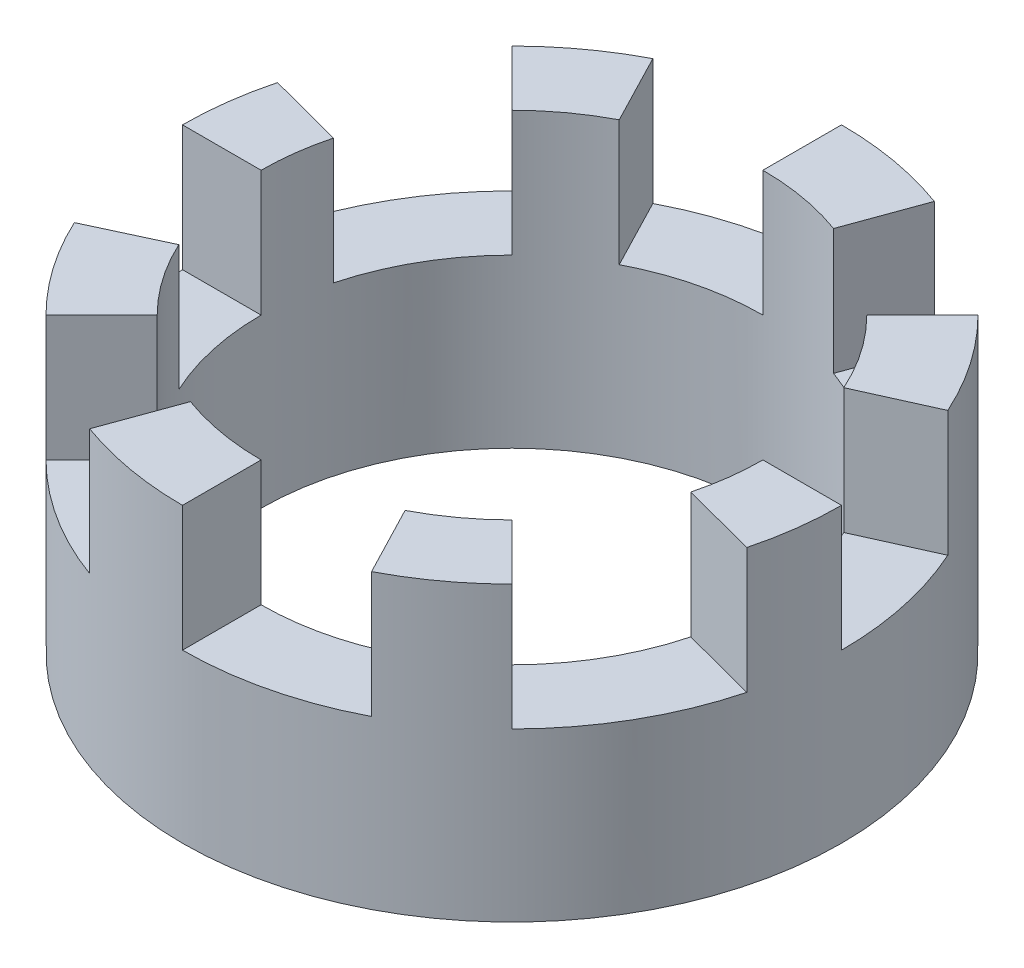
ISO-10303-21;
HEADER;
FILE_DESCRIPTION(('STEP AP214'),'2;1');
FILE_NAME('part.step','',(''),(''),'','','');
FILE_SCHEMA(('AUTOMOTIVE_DESIGN { 1 0 10303 214 1 1 1 1 }'));
ENDSEC;
DATA;
#1=APPLICATION_CONTEXT('core data for automotive mechanical design processes');
#2=APPLICATION_PROTOCOL_DEFINITION('international standard','automotive_design',2000,#1);
#3=PRODUCT_CONTEXT('',#1,'mechanical');
#4=PRODUCT('Part','Part','',(#3));
#5=PRODUCT_RELATED_PRODUCT_CATEGORY('part','',(#4));
#6=PRODUCT_DEFINITION_FORMATION('','',#4);
#7=PRODUCT_DEFINITION_CONTEXT('part definition',#1,'design');
#8=PRODUCT_DEFINITION('design','',#6,#7);
#9=PRODUCT_DEFINITION_SHAPE('','',#8);
#10=(LENGTH_UNIT() NAMED_UNIT(*) SI_UNIT(.MILLI.,.METRE.));
#11=(NAMED_UNIT(*) PLANE_ANGLE_UNIT() SI_UNIT($,.RADIAN.));
#12=(NAMED_UNIT(*) SI_UNIT($,.STERADIAN.) SOLID_ANGLE_UNIT());
#13=UNCERTAINTY_MEASURE_WITH_UNIT(LENGTH_MEASURE(1.E-05),#10,'distance_accuracy_value','');
#14=(GEOMETRIC_REPRESENTATION_CONTEXT(3) GLOBAL_UNCERTAINTY_ASSIGNED_CONTEXT((#13)) GLOBAL_UNIT_ASSIGNED_CONTEXT((#10,
#11,#12)) REPRESENTATION_CONTEXT('',''));
#15=CARTESIAN_POINT('',(0.,0.,0.));
#16=DIRECTION('',(0.,0.,1.));
#17=DIRECTION('',(1.,0.,0.));
#18=AXIS2_PLACEMENT_3D('',#15,#16,#17);
#19=CARTESIAN_POINT('',(0.,20.,0.));
#20=DIRECTION('',(0.,1.,0.));
#21=DIRECTION('',(0.,0.,1.));
#22=AXIS2_PLACEMENT_3D('',#19,#20,#21);
#23=PLANE('',#22);
#24=DIRECTION('',(0.460317164455009,0.,0.887754531448925));
#25=VECTOR('',#24,1.);
#26=CARTESIAN_POINT('',(3.60362018626562E-13,20.,-1.86854380028592E-13));
#27=LINE('',#26,#25);
#28=CARTESIAN_POINT('',(-18.136496279527,20.,-34.9775285390878));
#29=VERTEX_POINT('',#28);
#30=CARTESIAN_POINT('',(-13.8095149336499,20.,-26.6326359434679));
#31=VERTEX_POINT('',#30);
#32=EDGE_CURVE('E263',#29,#31,#27,.T.);
#33=ORIENTED_EDGE('',*,*,#32,.T.);
#34=CARTESIAN_POINT('',(0.,20.,0.));
#35=DIRECTION('',(0.,1.,0.));
#36=DIRECTION('',(0.,0.,1.));
#37=AXIS2_PLACEMENT_3D('',#34,#35,#36);
#38=CIRCLE('',#37,30.);
#39=CARTESIAN_POINT('',(0.,20.,-30.));
#40=VERTEX_POINT('',#39);
#41=EDGE_CURVE('E561',#40,#31,#38,.T.);
#42=ORIENTED_EDGE('',*,*,#41,.F.);
#43=DIRECTION('',(0.,0.,-1.));
#44=VECTOR('',#43,1.);
#45=CARTESIAN_POINT('',(0.,20.,0.));
#46=LINE('',#45,#44);
#47=CARTESIAN_POINT('',(0.,20.,-39.4));
#48=VERTEX_POINT('',#47);
#49=EDGE_CURVE('E71',#40,#48,#46,.T.);
#50=ORIENTED_EDGE('',*,*,#49,.T.);
#51=CARTESIAN_POINT('',(0.,20.,0.));
#52=DIRECTION('',(0.,1.,0.));
#53=DIRECTION('',(0.,0.,1.));
#54=AXIS2_PLACEMENT_3D('',#51,#52,#53);
#55=CIRCLE('',#54,39.4);
#56=EDGE_CURVE('E644',#48,#29,#55,.T.);
#57=ORIENTED_EDGE('',*,*,#56,.T.);
#58=EDGE_LOOP('',(#33,#42,#50,#57));
#59=FACE_BOUND('',#58,.T.);
#60=ADVANCED_FACE('F45',(#59),#23,.T.);
#61=DIRECTION('',(-0.707106781186556,0.,-0.707106781186539));
#62=VECTOR('',#61,1.);
#63=CARTESIAN_POINT('',(0.,20.,0.));
#64=LINE('',#63,#62);
#65=CARTESIAN_POINT('',(-21.2132034355967,20.,-21.2132034355962));
#66=VERTEX_POINT('',#65);
#67=CARTESIAN_POINT('',(-27.8600071787503,20.,-27.8600071787496));
#68=VERTEX_POINT('',#67);
#69=EDGE_CURVE('E63',#66,#68,#64,.T.);
#70=ORIENTED_EDGE('',*,*,#69,.T.);
#71=CARTESIAN_POINT('',(-38.0947187353614,20.,-10.0574551688639));
#72=VERTEX_POINT('',#71);
#73=EDGE_CURVE('E56',#68,#72,#55,.T.);
#74=ORIENTED_EDGE('',*,*,#73,.T.);
#75=DIRECTION('',(0.966871033892421,0.,0.255265359615834));
#76=VECTOR('',#75,1.);
#77=CARTESIAN_POINT('',(0.,20.,0.));
#78=LINE('',#77,#76);
#79=CARTESIAN_POINT('',(-29.0061310167726,20.,-7.65796078847503));
#80=VERTEX_POINT('',#79);
#81=EDGE_CURVE('E517',#72,#80,#78,.T.);
#82=ORIENTED_EDGE('',*,*,#81,.T.);
#83=EDGE_CURVE('E555',#66,#80,#38,.T.);
#84=ORIENTED_EDGE('',*,*,#83,.F.);
#85=EDGE_LOOP('',(#70,#74,#82,#84));
#86=FACE_BOUND('',#85,.T.);
#87=ADVANCED_FACE('F664',(#86),#23,.T.);
#88=DIRECTION('',(-0.911762985049743,0.,0.410716762615287));
#89=VECTOR('',#88,1.);
#90=CARTESIAN_POINT('',(0.,20.,0.));
#91=LINE('',#90,#89);
#92=CARTESIAN_POINT('',(35.9234616109599,20.,-16.1822404470424));
#93=VERTEX_POINT('',#92);
#94=CARTESIAN_POINT('',(27.3528895514923,20.,-12.3215028784587));
#95=VERTEX_POINT('',#94);
#96=EDGE_CURVE('E336',#93,#95,#91,.T.);
#97=ORIENTED_EDGE('',*,*,#96,.T.);
#98=CARTESIAN_POINT('',(30.,20.,0.));
#99=VERTEX_POINT('',#98);
#100=EDGE_CURVE('E571',#99,#95,#38,.T.);
#101=ORIENTED_EDGE('',*,*,#100,.F.);
#102=DIRECTION('',(1.,0.,0.));
#103=VECTOR('',#102,1.);
#104=CARTESIAN_POINT('',(0.,20.,0.));
#105=LINE('',#104,#103);
#106=CARTESIAN_POINT('',(39.4,20.,0.));
#107=VERTEX_POINT('',#106);
#108=EDGE_CURVE('E371',#99,#107,#105,.T.);
#109=ORIENTED_EDGE('',*,*,#108,.T.);
#110=EDGE_CURVE('E635',#107,#93,#55,.T.);
#111=ORIENTED_EDGE('',*,*,#110,.T.);
#112=EDGE_LOOP('',(#97,#101,#109,#111));
#113=FACE_BOUND('',#112,.T.);
#114=ADVANCED_FACE('F668',(#113),#23,.T.);
#115=DIRECTION('',(-0.342020143325669,0.,0.939692620785909));
#116=VECTOR('',#115,1.);
#117=CARTESIAN_POINT('',(0.,20.,0.));
#118=LINE('',#117,#116);
#119=CARTESIAN_POINT('',(13.4755936470314,20.,-37.0238892589648));
#120=VERTEX_POINT('',#119);
#121=CARTESIAN_POINT('',(10.2606042997701,20.,-28.1907786235773));
#122=VERTEX_POINT('',#121);
#123=EDGE_CURVE('E309',#120,#122,#118,.T.);
#124=ORIENTED_EDGE('',*,*,#123,.T.);
#125=CARTESIAN_POINT('',(21.2132034355967,20.,-21.2132034355961));
#126=VERTEX_POINT('',#125);
#127=EDGE_CURVE('E567',#126,#122,#38,.T.);
#128=ORIENTED_EDGE('',*,*,#127,.F.);
#129=DIRECTION('',(0.707106781186557,0.,-0.707106781186538));
#130=VECTOR('',#129,1.);
#131=CARTESIAN_POINT('',(0.,20.,0.));
#132=LINE('',#131,#130);
#133=CARTESIAN_POINT('',(27.8600071787504,20.,-27.8600071787496));
#134=VERTEX_POINT('',#133);
#135=EDGE_CURVE('E342',#126,#134,#132,.T.);
#136=ORIENTED_EDGE('',*,*,#135,.T.);
#137=EDGE_CURVE('E639',#134,#120,#55,.T.);
#138=ORIENTED_EDGE('',*,*,#137,.T.);
#139=EDGE_LOOP('',(#124,#128,#136,#138));
#140=FACE_BOUND('',#139,.T.);
#141=ADVANCED_FACE('F887',(#140),#23,.T.);
#142=DIRECTION('',(-0.461132733177778,0.,-0.887331168387537));
#143=VECTOR('',#142,1.);
#144=CARTESIAN_POINT('',(0.,20.,0.));
#145=LINE('',#144,#143);
#146=CARTESIAN_POINT('',(18.1686296872044,20.,34.960848034469));
#147=VERTEX_POINT('',#146);
#148=CARTESIAN_POINT('',(13.8339819953333,20.,26.6199350516262));
#149=VERTEX_POINT('',#148);
#150=EDGE_CURVE('E406',#147,#149,#145,.T.);
#151=ORIENTED_EDGE('',*,*,#150,.T.);
#152=CARTESIAN_POINT('',(0.,20.,30.));
#153=VERTEX_POINT('',#152);
#154=EDGE_CURVE('E581',#153,#149,#38,.T.);
#155=ORIENTED_EDGE('',*,*,#154,.F.);
#156=DIRECTION('',(0.,0.,1.));
#157=VECTOR('',#156,1.);
#158=CARTESIAN_POINT('',(0.,20.,0.));
#159=LINE('',#158,#157);
#160=CARTESIAN_POINT('',(0.,20.,39.4));
#161=VERTEX_POINT('',#160);
#162=EDGE_CURVE('E441',#153,#161,#159,.T.);
#163=ORIENTED_EDGE('',*,*,#162,.T.);
#164=EDGE_CURVE('E615',#161,#147,#55,.T.);
#165=ORIENTED_EDGE('',*,*,#164,.T.);
#166=EDGE_LOOP('',(#151,#155,#163,#165));
#167=FACE_BOUND('',#166,.T.);
#168=ADVANCED_FACE('F611',(#167),#23,.T.);
#169=DIRECTION('',(-0.967056113209118,0.,-0.254563300388869));
#170=VECTOR('',#169,1.);
#171=CARTESIAN_POINT('',(0.,20.,0.));
#172=LINE('',#171,#170);
#173=CARTESIAN_POINT('',(38.1020108604393,20.,10.0297940353214));
#174=VERTEX_POINT('',#173);
#175=CARTESIAN_POINT('',(29.0116833962735,20.,7.63689901166607));
#176=VERTEX_POINT('',#175);
#177=EDGE_CURVE('E377',#174,#176,#172,.T.);
#178=ORIENTED_EDGE('',*,*,#177,.T.);
#179=CARTESIAN_POINT('',(21.2132034355968,20.,21.2132034355961));
#180=VERTEX_POINT('',#179);
#181=EDGE_CURVE('E576',#180,#176,#38,.T.);
#182=ORIENTED_EDGE('',*,*,#181,.F.);
#183=DIRECTION('',(0.707106781186557,0.,0.707106781186538));
#184=VECTOR('',#183,1.);
#185=CARTESIAN_POINT('',(0.,20.,0.));
#186=LINE('',#185,#184);
#187=CARTESIAN_POINT('',(27.8600071787504,20.,27.8600071787495));
#188=VERTEX_POINT('',#187);
#189=EDGE_CURVE('E412',#180,#188,#186,.T.);
#190=ORIENTED_EDGE('',*,*,#189,.T.);
#191=EDGE_CURVE('E631',#188,#174,#55,.T.);
#192=ORIENTED_EDGE('',*,*,#191,.T.);
#193=EDGE_LOOP('',(#178,#182,#190,#192));
#194=FACE_BOUND('',#193,.T.);
#195=ADVANCED_FACE('F630',(#194),#23,.T.);
#196=DIRECTION('',(0.907086287984406,0.,-0.420944730517763));
#197=VECTOR('',#196,1.);
#198=CARTESIAN_POINT('',(0.,20.,0.));
#199=LINE('',#198,#197);
#200=CARTESIAN_POINT('',(-35.7391997465856,20.,16.5852223823998));
#201=VERTEX_POINT('',#200);
#202=CARTESIAN_POINT('',(-27.2125886395322,20.,12.6283419155328));
#203=VERTEX_POINT('',#202);
#204=EDGE_CURVE('E476',#201,#203,#199,.T.);
#205=ORIENTED_EDGE('',*,*,#204,.T.);
#206=CARTESIAN_POINT('',(-30.,20.,0.));
#207=VERTEX_POINT('',#206);
#208=EDGE_CURVE('E550',#207,#203,#38,.T.);
#209=ORIENTED_EDGE('',*,*,#208,.F.);
#210=DIRECTION('',(1.,0.,0.));
#211=VECTOR('',#210,1.);
#212=CARTESIAN_POINT('',(0.,20.,0.));
#213=LINE('',#212,#211);
#214=CARTESIAN_POINT('',(-39.4,20.,0.));
#215=VERTEX_POINT('',#214);
#216=EDGE_CURVE('E511',#215,#207,#213,.T.);
#217=ORIENTED_EDGE('',*,*,#216,.F.);
#218=EDGE_CURVE('E11',#215,#201,#55,.T.);
#219=ORIENTED_EDGE('',*,*,#218,.T.);
#220=EDGE_LOOP('',(#205,#209,#217,#219));
#221=FACE_BOUND('',#220,.T.);
#222=ADVANCED_FACE('F661',(#221),#23,.T.);
#223=DIRECTION('',(0.34202014332567,0.,-0.939692620785908));
#224=VECTOR('',#223,1.);
#225=CARTESIAN_POINT('',(0.,20.,0.));
#226=LINE('',#225,#224);
#227=CARTESIAN_POINT('',(-13.4755936470314,20.,37.0238892589648));
#228=VERTEX_POINT('',#227);
#229=CARTESIAN_POINT('',(-10.2606042997701,20.,28.1907786235772));
#230=VERTEX_POINT('',#229);
#231=EDGE_CURVE('E447',#228,#230,#226,.T.);
#232=ORIENTED_EDGE('',*,*,#231,.T.);
#233=CARTESIAN_POINT('',(-21.2132034355967,20.,21.2132034355962));
#234=VERTEX_POINT('',#233);
#235=EDGE_CURVE('E554',#234,#230,#38,.T.);
#236=ORIENTED_EDGE('',*,*,#235,.F.);
#237=DIRECTION('',(-0.707106781186557,0.,0.707106781186538));
#238=VECTOR('',#237,1.);
#239=CARTESIAN_POINT('',(0.,20.,0.));
#240=LINE('',#239,#238);
#241=CARTESIAN_POINT('',(-27.8600071787503,20.,27.8600071787496));
#242=VERTEX_POINT('',#241);
#243=EDGE_CURVE('E482',#234,#242,#240,.T.);
#244=ORIENTED_EDGE('',*,*,#243,.T.);
#245=EDGE_CURVE('E55',#242,#228,#55,.T.);
#246=ORIENTED_EDGE('',*,*,#245,.T.);
#247=EDGE_LOOP('',(#232,#236,#244,#246));
#248=FACE_BOUND('',#247,.T.);
#249=ADVANCED_FACE('F597',(#248),#23,.T.);
#250=CARTESIAN_POINT('',(0.,0.,0.));
#251=DIRECTION('',(0.,1.,0.));
#252=DIRECTION('',(0.,0.,1.));
#253=AXIS2_PLACEMENT_3D('',#250,#251,#252);
#254=PLANE('',#253);
#255=CARTESIAN_POINT('',(0.,0.,0.));
#256=DIRECTION('',(0.,1.,0.));
#257=DIRECTION('',(0.,0.,1.));
#258=AXIS2_PLACEMENT_3D('',#255,#256,#257);
#259=CIRCLE('',#258,39.4);
#260=CARTESIAN_POINT('',(0.,0.,39.4));
#261=VERTEX_POINT('',#260);
#262=EDGE_CURVE('E49',#261,#261,#259,.T.);
#263=ORIENTED_EDGE('',*,*,#262,.F.);
#264=EDGE_LOOP('',(#263));
#265=FACE_BOUND('',#264,.T.);
#266=CARTESIAN_POINT('',(0.,0.,0.));
#267=DIRECTION('',(0.,1.,0.));
#268=DIRECTION('',(0.,0.,1.));
#269=AXIS2_PLACEMENT_3D('',#266,#267,#268);
#270=CIRCLE('',#269,30.);
#271=CARTESIAN_POINT('',(0.,0.,30.));
#272=VERTEX_POINT('',#271);
#273=EDGE_CURVE('E549',#272,#272,#270,.T.);
#274=ORIENTED_EDGE('',*,*,#273,.T.);
#275=EDGE_LOOP('',(#274));
#276=FACE_BOUND('',#275,.T.);
#277=ADVANCED_FACE('F655',(#265,#276),#254,.F.);
#278=CARTESIAN_POINT('',(0.,20.,0.));
#279=DIRECTION('',(0.,-1.,0.));
#280=DIRECTION('',(0.,0.,-1.));
#281=AXIS2_PLACEMENT_3D('',#278,#279,#280);
#282=CYLINDRICAL_SURFACE('',#281,39.4);
#283=ORIENTED_EDGE('',*,*,#218,.F.);
#284=DIRECTION('',(0.,-1.,0.));
#285=VECTOR('',#284,1.);
#286=CARTESIAN_POINT('',(-39.4,35.,0.));
#287=LINE('',#286,#285);
#288=CARTESIAN_POINT('',(-39.4,35.,0.));
#289=VERTEX_POINT('',#288);
#290=EDGE_CURVE('E545',#289,#215,#287,.T.);
#291=ORIENTED_EDGE('',*,*,#290,.F.);
#292=CARTESIAN_POINT('',(0.,35.,0.));
#293=DIRECTION('',(0.,1.,0.));
#294=DIRECTION('',(0.,0.,1.));
#295=AXIS2_PLACEMENT_3D('',#292,#293,#294);
#296=CIRCLE('',#295,39.4);
#297=CARTESIAN_POINT('',(-38.0947187353614,35.,-10.0574551688639));
#298=VERTEX_POINT('',#297);
#299=EDGE_CURVE('E512',#298,#289,#296,.T.);
#300=ORIENTED_EDGE('',*,*,#299,.F.);
#301=DIRECTION('',(0.,-1.,0.));
#302=VECTOR('',#301,1.);
#303=CARTESIAN_POINT('',(-38.0947187353614,35.,-10.0574551688639));
#304=LINE('',#303,#302);
#305=EDGE_CURVE('E527',#298,#72,#304,.T.);
#306=ORIENTED_EDGE('',*,*,#305,.T.);
#307=ORIENTED_EDGE('',*,*,#73,.F.);
#308=DIRECTION('',(0.,-1.,0.));
#309=VECTOR('',#308,1.);
#310=CARTESIAN_POINT('',(-27.8600071787503,35.,-27.8600071787496));
#311=LINE('',#310,#309);
#312=CARTESIAN_POINT('',(-27.8600071787503,35.,-27.8600071787496));
#313=VERTEX_POINT('',#312);
#314=EDGE_CURVE('E268',#313,#68,#311,.T.);
#315=ORIENTED_EDGE('',*,*,#314,.F.);
#316=CARTESIAN_POINT('',(0.,35.,0.));
#317=DIRECTION('',(0.,1.,0.));
#318=DIRECTION('',(0.,0.,1.));
#319=AXIS2_PLACEMENT_3D('',#316,#317,#318);
#320=CIRCLE('',#319,39.4);
#321=CARTESIAN_POINT('',(-18.136496279527,35.,-34.9775285390878));
#322=VERTEX_POINT('',#321);
#323=EDGE_CURVE('E271',#322,#313,#320,.T.);
#324=ORIENTED_EDGE('',*,*,#323,.F.);
#325=DIRECTION('',(0.,-1.,0.));
#326=VECTOR('',#325,1.);
#327=CARTESIAN_POINT('',(-18.136496279527,35.,-34.9775285390878));
#328=LINE('',#327,#326);
#329=EDGE_CURVE('E257',#322,#29,#328,.T.);
#330=ORIENTED_EDGE('',*,*,#329,.T.);
#331=ORIENTED_EDGE('',*,*,#56,.F.);
#332=DIRECTION('',(0.,-1.,0.));
#333=VECTOR('',#332,1.);
#334=CARTESIAN_POINT('',(0.,35.,-39.4));
#335=LINE('',#334,#333);
#336=CARTESIAN_POINT('',(0.,35.,-39.4));
#337=VERTEX_POINT('',#336);
#338=EDGE_CURVE('E319',#337,#48,#335,.T.);
#339=ORIENTED_EDGE('',*,*,#338,.F.);
#340=CARTESIAN_POINT('',(0.,35.,0.));
#341=DIRECTION('',(0.,1.,0.));
#342=DIRECTION('',(0.,0.,1.));
#343=AXIS2_PLACEMENT_3D('',#340,#341,#342);
#344=CIRCLE('',#343,39.4);
#345=CARTESIAN_POINT('',(13.4755936470314,35.,-37.0238892589648));
#346=VERTEX_POINT('',#345);
#347=EDGE_CURVE('E316',#346,#337,#344,.T.);
#348=ORIENTED_EDGE('',*,*,#347,.F.);
#349=DIRECTION('',(0.,-1.,0.));
#350=VECTOR('',#349,1.);
#351=CARTESIAN_POINT('',(13.4755936470314,35.,-37.0238892589648));
#352=LINE('',#351,#350);
#353=EDGE_CURVE('E327',#346,#120,#352,.T.);
#354=ORIENTED_EDGE('',*,*,#353,.T.);
#355=ORIENTED_EDGE('',*,*,#137,.F.);
#356=DIRECTION('',(0.,-1.,0.));
#357=VECTOR('',#356,1.);
#358=CARTESIAN_POINT('',(27.8600071787504,35.,-27.8600071787496));
#359=LINE('',#358,#357);
#360=CARTESIAN_POINT('',(27.8600071787504,35.,-27.8600071787496));
#361=VERTEX_POINT('',#360);
#362=EDGE_CURVE('E365',#361,#134,#359,.T.);
#363=ORIENTED_EDGE('',*,*,#362,.F.);
#364=CARTESIAN_POINT('',(0.,35.,0.));
#365=DIRECTION('',(0.,1.,0.));
#366=DIRECTION('',(0.,0.,1.));
#367=AXIS2_PLACEMENT_3D('',#364,#365,#366);
#368=CIRCLE('',#367,39.4);
#369=CARTESIAN_POINT('',(35.9234616109599,35.,-16.1822404470424));
#370=VERTEX_POINT('',#369);
#371=EDGE_CURVE('E341',#370,#361,#368,.T.);
#372=ORIENTED_EDGE('',*,*,#371,.F.);
#373=DIRECTION('',(0.,-1.,0.));
#374=VECTOR('',#373,1.);
#375=CARTESIAN_POINT('',(35.9234616109599,35.,-16.1822404470424));
#376=LINE('',#375,#374);
#377=EDGE_CURVE('E368',#370,#93,#376,.T.);
#378=ORIENTED_EDGE('',*,*,#377,.T.);
#379=ORIENTED_EDGE('',*,*,#110,.F.);
#380=DIRECTION('',(0.,-1.,0.));
#381=VECTOR('',#380,1.);
#382=CARTESIAN_POINT('',(39.4,35.,0.));
#383=LINE('',#382,#381);
#384=CARTESIAN_POINT('',(39.4,35.,0.));
#385=VERTEX_POINT('',#384);
#386=EDGE_CURVE('E387',#385,#107,#383,.T.);
#387=ORIENTED_EDGE('',*,*,#386,.F.);
#388=CARTESIAN_POINT('',(0.,35.,0.));
#389=DIRECTION('',(0.,1.,0.));
#390=DIRECTION('',(0.,0.,1.));
#391=AXIS2_PLACEMENT_3D('',#388,#389,#390);
#392=CIRCLE('',#391,39.4);
#393=CARTESIAN_POINT('',(38.1020108604393,35.,10.0297940353214));
#394=VERTEX_POINT('',#393);
#395=EDGE_CURVE('E384',#394,#385,#392,.T.);
#396=ORIENTED_EDGE('',*,*,#395,.F.);
#397=DIRECTION('',(0.,-1.,0.));
#398=VECTOR('',#397,1.);
#399=CARTESIAN_POINT('',(38.1020108604393,35.,10.0297940353214));
#400=LINE('',#399,#398);
#401=EDGE_CURVE('E396',#394,#174,#400,.T.);
#402=ORIENTED_EDGE('',*,*,#401,.T.);
#403=ORIENTED_EDGE('',*,*,#191,.F.);
#404=DIRECTION('',(0.,-1.,0.));
#405=VECTOR('',#404,1.);
#406=CARTESIAN_POINT('',(27.8600071787504,35.,27.8600071787495));
#407=LINE('',#406,#405);
#408=CARTESIAN_POINT('',(27.8600071787504,35.,27.8600071787495));
#409=VERTEX_POINT('',#408);
#410=EDGE_CURVE('E435',#409,#188,#407,.T.);
#411=ORIENTED_EDGE('',*,*,#410,.F.);
#412=CARTESIAN_POINT('',(0.,35.,0.));
#413=DIRECTION('',(0.,1.,0.));
#414=DIRECTION('',(0.,0.,1.));
#415=AXIS2_PLACEMENT_3D('',#412,#413,#414);
#416=CIRCLE('',#415,39.4);
#417=CARTESIAN_POINT('',(18.1686296872044,35.,34.960848034469));
#418=VERTEX_POINT('',#417);
#419=EDGE_CURVE('E411',#418,#409,#416,.T.);
#420=ORIENTED_EDGE('',*,*,#419,.F.);
#421=DIRECTION('',(0.,-1.,0.));
#422=VECTOR('',#421,1.);
#423=CARTESIAN_POINT('',(18.1686296872044,35.,34.960848034469));
#424=LINE('',#423,#422);
#425=EDGE_CURVE('E438',#418,#147,#424,.T.);
#426=ORIENTED_EDGE('',*,*,#425,.T.);
#427=ORIENTED_EDGE('',*,*,#164,.F.);
#428=DIRECTION('',(0.,-1.,0.));
#429=VECTOR('',#428,1.);
#430=CARTESIAN_POINT('',(0.,35.,39.4));
#431=LINE('',#430,#429);
#432=CARTESIAN_POINT('',(0.,35.,39.4));
#433=VERTEX_POINT('',#432);
#434=EDGE_CURVE('E457',#433,#161,#431,.T.);
#435=ORIENTED_EDGE('',*,*,#434,.F.);
#436=CARTESIAN_POINT('',(0.,35.,0.));
#437=DIRECTION('',(0.,1.,0.));
#438=DIRECTION('',(0.,0.,1.));
#439=AXIS2_PLACEMENT_3D('',#436,#437,#438);
#440=CIRCLE('',#439,39.4);
#441=CARTESIAN_POINT('',(-13.4755936470314,35.,37.0238892589648));
#442=VERTEX_POINT('',#441);
#443=EDGE_CURVE('E454',#442,#433,#440,.T.);
#444=ORIENTED_EDGE('',*,*,#443,.F.);
#445=DIRECTION('',(0.,-1.,0.));
#446=VECTOR('',#445,1.);
#447=CARTESIAN_POINT('',(-13.4755936470314,35.,37.0238892589648));
#448=LINE('',#447,#446);
#449=EDGE_CURVE('E466',#442,#228,#448,.T.);
#450=ORIENTED_EDGE('',*,*,#449,.T.);
#451=ORIENTED_EDGE('',*,*,#245,.F.);
#452=DIRECTION('',(0.,-1.,0.));
#453=VECTOR('',#452,1.);
#454=CARTESIAN_POINT('',(-27.8600071787503,35.,27.8600071787496));
#455=LINE('',#454,#453);
#456=CARTESIAN_POINT('',(-27.8600071787503,35.,27.8600071787496));
#457=VERTEX_POINT('',#456);
#458=EDGE_CURVE('E505',#457,#242,#455,.T.);
#459=ORIENTED_EDGE('',*,*,#458,.F.);
#460=CARTESIAN_POINT('',(0.,35.,0.));
#461=DIRECTION('',(0.,1.,0.));
#462=DIRECTION('',(0.,0.,1.));
#463=AXIS2_PLACEMENT_3D('',#460,#461,#462);
#464=CIRCLE('',#463,39.4);
#465=CARTESIAN_POINT('',(-35.7391997465856,35.,16.5852223823998));
#466=VERTEX_POINT('',#465);
#467=EDGE_CURVE('E481',#466,#457,#464,.T.);
#468=ORIENTED_EDGE('',*,*,#467,.F.);
#469=DIRECTION('',(0.,-1.,0.));
#470=VECTOR('',#469,1.);
#471=CARTESIAN_POINT('',(-35.7391997465856,35.,16.5852223823998));
#472=LINE('',#471,#470);
#473=EDGE_CURVE('E508',#466,#201,#472,.T.);
#474=ORIENTED_EDGE('',*,*,#473,.T.);
#475=EDGE_LOOP('',(#283,#291,#300,#306,#307,#315,#324,#330,#331,#339,#348,#354,#355,#363,#372,
#378,#379,#387,#396,#402,#403,#411,#420,#426,#427,#435,#444,#450,#451,#459,#468,#474));
#476=FACE_BOUND('',#475,.T.);
#477=ORIENTED_EDGE('',*,*,#262,.T.);
#478=EDGE_LOOP('',(#477));
#479=FACE_BOUND('',#478,.T.);
#480=ADVANCED_FACE('F47',(#476,#479),#282,.T.);
#481=CARTESIAN_POINT('',(0.,20.,0.));
#482=DIRECTION('',(0.,-1.,0.));
#483=DIRECTION('',(0.,0.,-1.));
#484=AXIS2_PLACEMENT_3D('',#481,#482,#483);
#485=CYLINDRICAL_SURFACE('',#484,30.);
#486=ORIENTED_EDGE('',*,*,#208,.T.);
#487=DIRECTION('',(0.,-1.,0.));
#488=VECTOR('',#487,1.);
#489=CARTESIAN_POINT('',(-27.2125886395322,35.,12.6283419155328));
#490=LINE('',#489,#488);
#491=CARTESIAN_POINT('',(-27.2125886395322,35.,12.6283419155328));
#492=VERTEX_POINT('',#491);
#493=EDGE_CURVE('E492',#492,#203,#490,.T.);
#494=ORIENTED_EDGE('',*,*,#493,.F.);
#495=CARTESIAN_POINT('',(0.,35.,0.));
#496=DIRECTION('',(0.,1.,0.));
#497=DIRECTION('',(0.,0.,1.));
#498=AXIS2_PLACEMENT_3D('',#495,#496,#497);
#499=CIRCLE('',#498,30.);
#500=CARTESIAN_POINT('',(-21.2132034355967,35.,21.2132034355962));
#501=VERTEX_POINT('',#500);
#502=EDGE_CURVE('E489',#501,#492,#499,.F.);
#503=ORIENTED_EDGE('',*,*,#502,.F.);
#504=DIRECTION('',(0.,-1.,0.));
#505=VECTOR('',#504,1.);
#506=CARTESIAN_POINT('',(-21.2132034355967,35.,21.2132034355962));
#507=LINE('',#506,#505);
#508=EDGE_CURVE('E501',#501,#234,#507,.T.);
#509=ORIENTED_EDGE('',*,*,#508,.T.);
#510=ORIENTED_EDGE('',*,*,#235,.T.);
#511=DIRECTION('',(0.,-1.,0.));
#512=VECTOR('',#511,1.);
#513=CARTESIAN_POINT('',(-10.2606042997701,35.,28.1907786235772));
#514=LINE('',#513,#512);
#515=CARTESIAN_POINT('',(-10.2606042997701,35.,28.1907786235772));
#516=VERTEX_POINT('',#515);
#517=EDGE_CURVE('E469',#516,#230,#514,.T.);
#518=ORIENTED_EDGE('',*,*,#517,.F.);
#519=CARTESIAN_POINT('',(0.,35.,0.));
#520=DIRECTION('',(0.,1.,0.));
#521=DIRECTION('',(0.,0.,1.));
#522=AXIS2_PLACEMENT_3D('',#519,#520,#521);
#523=CIRCLE('',#522,30.);
#524=CARTESIAN_POINT('',(0.,35.,30.));
#525=VERTEX_POINT('',#524);
#526=EDGE_CURVE('E446',#525,#516,#523,.F.);
#527=ORIENTED_EDGE('',*,*,#526,.F.);
#528=DIRECTION('',(0.,-1.,0.));
#529=VECTOR('',#528,1.);
#530=CARTESIAN_POINT('',(0.,35.,30.));
#531=LINE('',#530,#529);
#532=EDGE_CURVE('E472',#525,#153,#531,.T.);
#533=ORIENTED_EDGE('',*,*,#532,.T.);
#534=ORIENTED_EDGE('',*,*,#154,.T.);
#535=DIRECTION('',(0.,-1.,0.));
#536=VECTOR('',#535,1.);
#537=CARTESIAN_POINT('',(13.8339819953333,35.,26.6199350516262));
#538=LINE('',#537,#536);
#539=CARTESIAN_POINT('',(13.8339819953333,35.,26.6199350516262));
#540=VERTEX_POINT('',#539);
#541=EDGE_CURVE('E422',#540,#149,#538,.T.);
#542=ORIENTED_EDGE('',*,*,#541,.F.);
#543=CARTESIAN_POINT('',(0.,35.,0.));
#544=DIRECTION('',(0.,1.,0.));
#545=DIRECTION('',(0.,0.,1.));
#546=AXIS2_PLACEMENT_3D('',#543,#544,#545);
#547=CIRCLE('',#546,30.);
#548=CARTESIAN_POINT('',(21.2132034355968,35.,21.2132034355961));
#549=VERTEX_POINT('',#548);
#550=EDGE_CURVE('E419',#549,#540,#547,.F.);
#551=ORIENTED_EDGE('',*,*,#550,.F.);
#552=DIRECTION('',(0.,-1.,0.));
#553=VECTOR('',#552,1.);
#554=CARTESIAN_POINT('',(21.2132034355968,35.,21.2132034355961));
#555=LINE('',#554,#553);
#556=EDGE_CURVE('E431',#549,#180,#555,.T.);
#557=ORIENTED_EDGE('',*,*,#556,.T.);
#558=ORIENTED_EDGE('',*,*,#181,.T.);
#559=DIRECTION('',(0.,-1.,0.));
#560=VECTOR('',#559,1.);
#561=CARTESIAN_POINT('',(29.0116833962735,35.,7.63689901166607));
#562=LINE('',#561,#560);
#563=CARTESIAN_POINT('',(29.0116833962735,35.,7.63689901166607));
#564=VERTEX_POINT('',#563);
#565=EDGE_CURVE('E399',#564,#176,#562,.T.);
#566=ORIENTED_EDGE('',*,*,#565,.F.);
#567=CARTESIAN_POINT('',(0.,35.,0.));
#568=DIRECTION('',(0.,1.,0.));
#569=DIRECTION('',(0.,0.,1.));
#570=AXIS2_PLACEMENT_3D('',#567,#568,#569);
#571=CIRCLE('',#570,30.);
#572=CARTESIAN_POINT('',(30.,35.,0.));
#573=VERTEX_POINT('',#572);
#574=EDGE_CURVE('E376',#573,#564,#571,.F.);
#575=ORIENTED_EDGE('',*,*,#574,.F.);
#576=DIRECTION('',(0.,-1.,0.));
#577=VECTOR('',#576,1.);
#578=CARTESIAN_POINT('',(30.,35.,0.));
#579=LINE('',#578,#577);
#580=EDGE_CURVE('E402',#573,#99,#579,.T.);
#581=ORIENTED_EDGE('',*,*,#580,.T.);
#582=ORIENTED_EDGE('',*,*,#100,.T.);
#583=DIRECTION('',(0.,-1.,0.));
#584=VECTOR('',#583,1.);
#585=CARTESIAN_POINT('',(27.3528895514923,35.,-12.3215028784587));
#586=LINE('',#585,#584);
#587=CARTESIAN_POINT('',(27.3528895514923,35.,-12.3215028784587));
#588=VERTEX_POINT('',#587);
#589=EDGE_CURVE('E352',#588,#95,#586,.T.);
#590=ORIENTED_EDGE('',*,*,#589,.F.);
#591=CARTESIAN_POINT('',(0.,35.,0.));
#592=DIRECTION('',(0.,1.,0.));
#593=DIRECTION('',(0.,0.,1.));
#594=AXIS2_PLACEMENT_3D('',#591,#592,#593);
#595=CIRCLE('',#594,30.);
#596=CARTESIAN_POINT('',(21.2132034355967,35.,-21.2132034355961));
#597=VERTEX_POINT('',#596);
#598=EDGE_CURVE('E349',#597,#588,#595,.F.);
#599=ORIENTED_EDGE('',*,*,#598,.F.);
#600=DIRECTION('',(0.,-1.,0.));
#601=VECTOR('',#600,1.);
#602=CARTESIAN_POINT('',(21.2132034355967,35.,-21.2132034355961));
#603=LINE('',#602,#601);
#604=EDGE_CURVE('E361',#597,#126,#603,.T.);
#605=ORIENTED_EDGE('',*,*,#604,.T.);
#606=ORIENTED_EDGE('',*,*,#127,.T.);
#607=DIRECTION('',(0.,-1.,0.));
#608=VECTOR('',#607,1.);
#609=CARTESIAN_POINT('',(10.2606042997701,35.,-28.1907786235773));
#610=LINE('',#609,#608);
#611=CARTESIAN_POINT('',(10.2606042997701,35.,-28.1907786235773));
#612=VERTEX_POINT('',#611);
#613=EDGE_CURVE('E330',#612,#122,#610,.T.);
#614=ORIENTED_EDGE('',*,*,#613,.F.);
#615=CARTESIAN_POINT('',(0.,35.,0.));
#616=DIRECTION('',(0.,1.,0.));
#617=DIRECTION('',(0.,0.,1.));
#618=AXIS2_PLACEMENT_3D('',#615,#616,#617);
#619=CIRCLE('',#618,30.);
#620=CARTESIAN_POINT('',(0.,35.,-30.));
#621=VERTEX_POINT('',#620);
#622=EDGE_CURVE('E308',#621,#612,#619,.F.);
#623=ORIENTED_EDGE('',*,*,#622,.F.);
#624=DIRECTION('',(0.,-1.,0.));
#625=VECTOR('',#624,1.);
#626=CARTESIAN_POINT('',(0.,35.,-30.));
#627=LINE('',#626,#625);
#628=EDGE_CURVE('E333',#621,#40,#627,.T.);
#629=ORIENTED_EDGE('',*,*,#628,.T.);
#630=ORIENTED_EDGE('',*,*,#41,.T.);
#631=DIRECTION('',(0.,-1.,0.));
#632=VECTOR('',#631,1.);
#633=CARTESIAN_POINT('',(-13.8095149336499,35.,-26.6326359434679));
#634=LINE('',#633,#632);
#635=CARTESIAN_POINT('',(-13.8095149336499,35.,-26.6326359434679));
#636=VERTEX_POINT('',#635);
#637=EDGE_CURVE('E294',#636,#31,#634,.T.);
#638=ORIENTED_EDGE('',*,*,#637,.F.);
#639=CARTESIAN_POINT('',(0.,35.,0.));
#640=DIRECTION('',(0.,1.,0.));
#641=DIRECTION('',(0.,0.,1.));
#642=AXIS2_PLACEMENT_3D('',#639,#640,#641);
#643=CIRCLE('',#642,30.);
#644=CARTESIAN_POINT('',(-21.2132034355967,35.,-21.2132034355962));
#645=VERTEX_POINT('',#644);
#646=EDGE_CURVE('E283',#645,#636,#643,.F.);
#647=ORIENTED_EDGE('',*,*,#646,.F.);
#648=DIRECTION('',(0.,-1.,0.));
#649=VECTOR('',#648,1.);
#650=CARTESIAN_POINT('',(-21.2132034355967,35.,-21.2132034355962));
#651=LINE('',#650,#649);
#652=EDGE_CURVE('E299',#645,#66,#651,.T.);
#653=ORIENTED_EDGE('',*,*,#652,.T.);
#654=ORIENTED_EDGE('',*,*,#83,.T.);
#655=DIRECTION('',(0.,-1.,0.));
#656=VECTOR('',#655,1.);
#657=CARTESIAN_POINT('',(-29.0061310167726,35.,-7.65796078847503));
#658=LINE('',#657,#656);
#659=CARTESIAN_POINT('',(-29.0061310167726,35.,-7.65796078847503));
#660=VERTEX_POINT('',#659);
#661=EDGE_CURVE('E537',#660,#80,#658,.T.);
#662=ORIENTED_EDGE('',*,*,#661,.F.);
#663=CARTESIAN_POINT('',(0.,35.,0.));
#664=DIRECTION('',(0.,1.,0.));
#665=DIRECTION('',(0.,0.,1.));
#666=AXIS2_PLACEMENT_3D('',#663,#664,#665);
#667=CIRCLE('',#666,30.);
#668=CARTESIAN_POINT('',(-30.,35.,0.));
#669=VERTEX_POINT('',#668);
#670=EDGE_CURVE('E520',#669,#660,#667,.F.);
#671=ORIENTED_EDGE('',*,*,#670,.F.);
#672=DIRECTION('',(0.,-1.,0.));
#673=VECTOR('',#672,1.);
#674=CARTESIAN_POINT('',(-30.,35.,0.));
#675=LINE('',#674,#673);
#676=EDGE_CURVE('E541',#669,#207,#675,.T.);
#677=ORIENTED_EDGE('',*,*,#676,.T.);
#678=EDGE_LOOP('',(#486,#494,#503,#509,#510,#518,#527,#533,#534,#542,#551,#557,#558,#566,#575,
#581,#582,#590,#599,#605,#606,#614,#623,#629,#630,#638,#647,#653,#654,#662,#671,#677));
#679=FACE_BOUND('',#678,.T.);
#680=ORIENTED_EDGE('',*,*,#273,.F.);
#681=EDGE_LOOP('',(#680));
#682=FACE_BOUND('',#681,.T.);
#683=ADVANCED_FACE('F592',(#679,#682),#485,.F.);
#684=CARTESIAN_POINT('',(0.,35.,0.));
#685=DIRECTION('',(0.,0.,-1.));
#686=DIRECTION('',(-1.,0.,0.));
#687=AXIS2_PLACEMENT_3D('',#684,#685,#686);
#688=PLANE('',#687);
#689=ORIENTED_EDGE('',*,*,#216,.T.);
#690=ORIENTED_EDGE('',*,*,#676,.F.);
#691=DIRECTION('',(1.,0.,0.));
#692=VECTOR('',#691,1.);
#693=CARTESIAN_POINT('',(0.,35.,0.));
#694=LINE('',#693,#692);
#695=EDGE_CURVE('E516',#289,#669,#694,.T.);
#696=ORIENTED_EDGE('',*,*,#695,.F.);
#697=ORIENTED_EDGE('',*,*,#290,.T.);
#698=EDGE_LOOP('',(#689,#690,#696,#697));
#699=FACE_BOUND('',#698,.T.);
#700=ADVANCED_FACE('F672',(#699),#688,.F.);
#701=CARTESIAN_POINT('',(0.,35.,0.));
#702=DIRECTION('',(0.255265359615834,0.,-0.966871033892421));
#703=DIRECTION('',(-0.966871033892421,0.,-0.255265359615834));
#704=AXIS2_PLACEMENT_3D('',#701,#702,#703);
#705=PLANE('',#704);
#706=ORIENTED_EDGE('',*,*,#81,.F.);
#707=ORIENTED_EDGE('',*,*,#305,.F.);
#708=DIRECTION('',(0.966871033892421,0.,0.255265359615834));
#709=VECTOR('',#708,1.);
#710=CARTESIAN_POINT('',(0.,35.,0.));
#711=LINE('',#710,#709);
#712=EDGE_CURVE('E523',#298,#660,#711,.T.);
#713=ORIENTED_EDGE('',*,*,#712,.T.);
#714=ORIENTED_EDGE('',*,*,#661,.T.);
#715=EDGE_LOOP('',(#706,#707,#713,#714));
#716=FACE_BOUND('',#715,.T.);
#717=ADVANCED_FACE('F675',(#716),#705,.T.);
#718=CARTESIAN_POINT('',(0.,35.,0.));
#719=DIRECTION('',(0.,1.,0.));
#720=DIRECTION('',(0.,0.,1.));
#721=AXIS2_PLACEMENT_3D('',#718,#719,#720);
#722=PLANE('',#721);
#723=ORIENTED_EDGE('',*,*,#299,.T.);
#724=ORIENTED_EDGE('',*,*,#695,.T.);
#725=ORIENTED_EDGE('',*,*,#670,.T.);
#726=ORIENTED_EDGE('',*,*,#712,.F.);
#727=EDGE_LOOP('',(#723,#724,#725,#726));
#728=FACE_BOUND('',#727,.T.);
#729=ADVANCED_FACE('F679',(#728),#722,.T.);
#730=CARTESIAN_POINT('',(0.,35.,0.));
#731=DIRECTION('',(-0.420944730517763,0.,-0.907086287984406));
#732=DIRECTION('',(-0.907086287984406,0.,0.420944730517763));
#733=AXIS2_PLACEMENT_3D('',#730,#731,#732);
#734=PLANE('',#733);
#735=ORIENTED_EDGE('',*,*,#204,.F.);
#736=ORIENTED_EDGE('',*,*,#473,.F.);
#737=DIRECTION('',(0.907086287984406,0.,-0.420944730517763));
#738=VECTOR('',#737,1.);
#739=CARTESIAN_POINT('',(0.,35.,0.));
#740=LINE('',#739,#738);
#741=EDGE_CURVE('E477',#466,#492,#740,.T.);
#742=ORIENTED_EDGE('',*,*,#741,.T.);
#743=ORIENTED_EDGE('',*,*,#493,.T.);
#744=EDGE_LOOP('',(#735,#736,#742,#743));
#745=FACE_BOUND('',#744,.T.);
#746=ADVANCED_FACE('F683',(#745),#734,.T.);
#747=CARTESIAN_POINT('',(0.,35.,0.));
#748=DIRECTION('',(0.707106781186538,0.,0.707106781186557));
#749=DIRECTION('',(0.707106781186557,0.,-0.707106781186538));
#750=AXIS2_PLACEMENT_3D('',#747,#748,#749);
#751=PLANE('',#750);
#752=ORIENTED_EDGE('',*,*,#243,.F.);
#753=ORIENTED_EDGE('',*,*,#508,.F.);
#754=DIRECTION('',(-0.707106781186557,0.,0.707106781186538));
#755=VECTOR('',#754,1.);
#756=CARTESIAN_POINT('',(0.,35.,0.));
#757=LINE('',#756,#755);
#758=EDGE_CURVE('E485',#501,#457,#757,.T.);
#759=ORIENTED_EDGE('',*,*,#758,.T.);
#760=ORIENTED_EDGE('',*,*,#458,.T.);
#761=EDGE_LOOP('',(#752,#753,#759,#760));
#762=FACE_BOUND('',#761,.T.);
#763=ADVANCED_FACE('F687',(#762),#751,.T.);
#764=CARTESIAN_POINT('',(0.,35.,0.));
#765=DIRECTION('',(0.,1.,0.));
#766=DIRECTION('',(0.,0.,1.));
#767=AXIS2_PLACEMENT_3D('',#764,#765,#766);
#768=PLANE('',#767);
#769=ORIENTED_EDGE('',*,*,#741,.F.);
#770=ORIENTED_EDGE('',*,*,#467,.T.);
#771=ORIENTED_EDGE('',*,*,#758,.F.);
#772=ORIENTED_EDGE('',*,*,#502,.T.);
#773=EDGE_LOOP('',(#769,#770,#771,#772));
#774=FACE_BOUND('',#773,.T.);
#775=ADVANCED_FACE('F691',(#774),#768,.T.);
#776=CARTESIAN_POINT('',(0.,35.,0.));
#777=DIRECTION('',(1.,0.,0.));
#778=DIRECTION('',(0.,0.,-1.));
#779=AXIS2_PLACEMENT_3D('',#776,#777,#778);
#780=PLANE('',#779);
#781=ORIENTED_EDGE('',*,*,#162,.F.);
#782=ORIENTED_EDGE('',*,*,#532,.F.);
#783=DIRECTION('',(0.,0.,1.));
#784=VECTOR('',#783,1.);
#785=CARTESIAN_POINT('',(0.,35.,0.));
#786=LINE('',#785,#784);
#787=EDGE_CURVE('E442',#525,#433,#786,.T.);
#788=ORIENTED_EDGE('',*,*,#787,.T.);
#789=ORIENTED_EDGE('',*,*,#434,.T.);
#790=EDGE_LOOP('',(#781,#782,#788,#789));
#791=FACE_BOUND('',#790,.T.);
#792=ADVANCED_FACE('F695',(#791),#780,.T.);
#793=CARTESIAN_POINT('',(0.,35.,0.));
#794=DIRECTION('',(-0.939692620785908,0.,-0.34202014332567));
#795=DIRECTION('',(-0.34202014332567,0.,0.939692620785908));
#796=AXIS2_PLACEMENT_3D('',#793,#794,#795);
#797=PLANE('',#796);
#798=ORIENTED_EDGE('',*,*,#231,.F.);
#799=ORIENTED_EDGE('',*,*,#449,.F.);
#800=DIRECTION('',(0.34202014332567,0.,-0.939692620785908));
#801=VECTOR('',#800,1.);
#802=CARTESIAN_POINT('',(0.,35.,0.));
#803=LINE('',#802,#801);
#804=EDGE_CURVE('E450',#442,#516,#803,.T.);
#805=ORIENTED_EDGE('',*,*,#804,.T.);
#806=ORIENTED_EDGE('',*,*,#517,.T.);
#807=EDGE_LOOP('',(#798,#799,#805,#806));
#808=FACE_BOUND('',#807,.T.);
#809=ADVANCED_FACE('F602',(#808),#797,.T.);
#810=CARTESIAN_POINT('',(0.,35.,0.));
#811=DIRECTION('',(0.,1.,0.));
#812=DIRECTION('',(0.,0.,1.));
#813=AXIS2_PLACEMENT_3D('',#810,#811,#812);
#814=PLANE('',#813);
#815=ORIENTED_EDGE('',*,*,#787,.F.);
#816=ORIENTED_EDGE('',*,*,#526,.T.);
#817=ORIENTED_EDGE('',*,*,#804,.F.);
#818=ORIENTED_EDGE('',*,*,#443,.T.);
#819=EDGE_LOOP('',(#815,#816,#817,#818));
#820=FACE_BOUND('',#819,.T.);
#821=ADVANCED_FACE('F607',(#820),#814,.T.);
#822=CARTESIAN_POINT('',(0.,35.,0.));
#823=DIRECTION('',(-0.887331168387537,0.,0.461132733177778));
#824=DIRECTION('',(0.461132733177778,0.,0.887331168387537));
#825=AXIS2_PLACEMENT_3D('',#822,#823,#824);
#826=PLANE('',#825);
#827=ORIENTED_EDGE('',*,*,#150,.F.);
#828=ORIENTED_EDGE('',*,*,#425,.F.);
#829=DIRECTION('',(-0.461132733177778,0.,-0.887331168387537));
#830=VECTOR('',#829,1.);
#831=CARTESIAN_POINT('',(0.,35.,0.));
#832=LINE('',#831,#830);
#833=EDGE_CURVE('E407',#418,#540,#832,.T.);
#834=ORIENTED_EDGE('',*,*,#833,.T.);
#835=ORIENTED_EDGE('',*,*,#541,.T.);
#836=EDGE_LOOP('',(#827,#828,#834,#835));
#837=FACE_BOUND('',#836,.T.);
#838=ADVANCED_FACE('F617',(#837),#826,.T.);
#839=CARTESIAN_POINT('',(0.,35.,0.));
#840=DIRECTION('',(0.707106781186538,0.,-0.707106781186557));
#841=DIRECTION('',(-0.707106781186557,0.,-0.707106781186538));
#842=AXIS2_PLACEMENT_3D('',#839,#840,#841);
#843=PLANE('',#842);
#844=ORIENTED_EDGE('',*,*,#189,.F.);
#845=ORIENTED_EDGE('',*,*,#556,.F.);
#846=DIRECTION('',(0.707106781186557,0.,0.707106781186538));
#847=VECTOR('',#846,1.);
#848=CARTESIAN_POINT('',(0.,35.,0.));
#849=LINE('',#848,#847);
#850=EDGE_CURVE('E415',#549,#409,#849,.T.);
#851=ORIENTED_EDGE('',*,*,#850,.T.);
#852=ORIENTED_EDGE('',*,*,#410,.T.);
#853=EDGE_LOOP('',(#844,#845,#851,#852));
#854=FACE_BOUND('',#853,.T.);
#855=ADVANCED_FACE('F626',(#854),#843,.T.);
#856=CARTESIAN_POINT('',(0.,35.,0.));
#857=DIRECTION('',(0.,1.,0.));
#858=DIRECTION('',(0.,0.,1.));
#859=AXIS2_PLACEMENT_3D('',#856,#857,#858);
#860=PLANE('',#859);
#861=ORIENTED_EDGE('',*,*,#833,.F.);
#862=ORIENTED_EDGE('',*,*,#419,.T.);
#863=ORIENTED_EDGE('',*,*,#850,.F.);
#864=ORIENTED_EDGE('',*,*,#550,.T.);
#865=EDGE_LOOP('',(#861,#862,#863,#864));
#866=FACE_BOUND('',#865,.T.);
#867=ADVANCED_FACE('F623',(#866),#860,.T.);
#868=CARTESIAN_POINT('',(0.,35.,0.));
#869=DIRECTION('',(0.,0.,-1.));
#870=DIRECTION('',(-1.,0.,0.));
#871=AXIS2_PLACEMENT_3D('',#868,#869,#870);
#872=PLANE('',#871);
#873=ORIENTED_EDGE('',*,*,#108,.F.);
#874=ORIENTED_EDGE('',*,*,#580,.F.);
#875=DIRECTION('',(1.,0.,0.));
#876=VECTOR('',#875,1.);
#877=CARTESIAN_POINT('',(0.,35.,0.));
#878=LINE('',#877,#876);
#879=EDGE_CURVE('E372',#573,#385,#878,.T.);
#880=ORIENTED_EDGE('',*,*,#879,.T.);
#881=ORIENTED_EDGE('',*,*,#386,.T.);
#882=EDGE_LOOP('',(#873,#874,#880,#881));
#883=FACE_BOUND('',#882,.T.);
#884=ADVANCED_FACE('F709',(#883),#872,.T.);
#885=CARTESIAN_POINT('',(0.,35.,0.));
#886=DIRECTION('',(-0.254563300388869,0.,0.967056113209118));
#887=DIRECTION('',(0.967056113209118,0.,0.254563300388869));
#888=AXIS2_PLACEMENT_3D('',#885,#886,#887);
#889=PLANE('',#888);
#890=ORIENTED_EDGE('',*,*,#177,.F.);
#891=ORIENTED_EDGE('',*,*,#401,.F.);
#892=DIRECTION('',(-0.967056113209118,0.,-0.254563300388869));
#893=VECTOR('',#892,1.);
#894=CARTESIAN_POINT('',(0.,35.,0.));
#895=LINE('',#894,#893);
#896=EDGE_CURVE('E380',#394,#564,#895,.T.);
#897=ORIENTED_EDGE('',*,*,#896,.T.);
#898=ORIENTED_EDGE('',*,*,#565,.T.);
#899=EDGE_LOOP('',(#890,#891,#897,#898));
#900=FACE_BOUND('',#899,.T.);
#901=ADVANCED_FACE('F712',(#900),#889,.T.);
#902=CARTESIAN_POINT('',(0.,35.,0.));
#903=DIRECTION('',(0.,1.,0.));
#904=DIRECTION('',(0.,0.,1.));
#905=AXIS2_PLACEMENT_3D('',#902,#903,#904);
#906=PLANE('',#905);
#907=ORIENTED_EDGE('',*,*,#879,.F.);
#908=ORIENTED_EDGE('',*,*,#574,.T.);
#909=ORIENTED_EDGE('',*,*,#896,.F.);
#910=ORIENTED_EDGE('',*,*,#395,.T.);
#911=EDGE_LOOP('',(#907,#908,#909,#910));
#912=FACE_BOUND('',#911,.T.);
#913=ADVANCED_FACE('F716',(#912),#906,.T.);
#914=CARTESIAN_POINT('',(0.,35.,0.));
#915=DIRECTION('',(0.410716762615287,0.,0.911762985049743));
#916=DIRECTION('',(0.911762985049743,0.,-0.410716762615287));
#917=AXIS2_PLACEMENT_3D('',#914,#915,#916);
#918=PLANE('',#917);
#919=ORIENTED_EDGE('',*,*,#96,.F.);
#920=ORIENTED_EDGE('',*,*,#377,.F.);
#921=DIRECTION('',(-0.911762985049743,0.,0.410716762615287));
#922=VECTOR('',#921,1.);
#923=CARTESIAN_POINT('',(0.,35.,0.));
#924=LINE('',#923,#922);
#925=EDGE_CURVE('E337',#370,#588,#924,.T.);
#926=ORIENTED_EDGE('',*,*,#925,.T.);
#927=ORIENTED_EDGE('',*,*,#589,.T.);
#928=EDGE_LOOP('',(#919,#920,#926,#927));
#929=FACE_BOUND('',#928,.T.);
#930=ADVANCED_FACE('F720',(#929),#918,.T.);
#931=CARTESIAN_POINT('',(0.,35.,0.));
#932=DIRECTION('',(-0.707106781186538,0.,-0.707106781186557));
#933=DIRECTION('',(-0.707106781186557,0.,0.707106781186538));
#934=AXIS2_PLACEMENT_3D('',#931,#932,#933);
#935=PLANE('',#934);
#936=ORIENTED_EDGE('',*,*,#135,.F.);
#937=ORIENTED_EDGE('',*,*,#604,.F.);
#938=DIRECTION('',(0.707106781186557,0.,-0.707106781186538));
#939=VECTOR('',#938,1.);
#940=CARTESIAN_POINT('',(0.,35.,0.));
#941=LINE('',#940,#939);
#942=EDGE_CURVE('E345',#597,#361,#941,.T.);
#943=ORIENTED_EDGE('',*,*,#942,.T.);
#944=ORIENTED_EDGE('',*,*,#362,.T.);
#945=EDGE_LOOP('',(#936,#937,#943,#944));
#946=FACE_BOUND('',#945,.T.);
#947=ADVANCED_FACE('F724',(#946),#935,.T.);
#948=CARTESIAN_POINT('',(0.,35.,0.));
#949=DIRECTION('',(0.,1.,0.));
#950=DIRECTION('',(0.,0.,1.));
#951=AXIS2_PLACEMENT_3D('',#948,#949,#950);
#952=PLANE('',#951);
#953=ORIENTED_EDGE('',*,*,#925,.F.);
#954=ORIENTED_EDGE('',*,*,#371,.T.);
#955=ORIENTED_EDGE('',*,*,#942,.F.);
#956=ORIENTED_EDGE('',*,*,#598,.T.);
#957=EDGE_LOOP('',(#953,#954,#955,#956));
#958=FACE_BOUND('',#957,.T.);
#959=ADVANCED_FACE('F728',(#958),#952,.T.);
#960=CARTESIAN_POINT('',(0.,35.,0.));
#961=DIRECTION('',(-1.,0.,0.));
#962=DIRECTION('',(0.,0.,1.));
#963=AXIS2_PLACEMENT_3D('',#960,#961,#962);
#964=PLANE('',#963);
#965=ORIENTED_EDGE('',*,*,#49,.F.);
#966=ORIENTED_EDGE('',*,*,#628,.F.);
#967=DIRECTION('',(0.,0.,-1.));
#968=VECTOR('',#967,1.);
#969=CARTESIAN_POINT('',(0.,35.,0.));
#970=LINE('',#969,#968);
#971=EDGE_CURVE('E304',#621,#337,#970,.T.);
#972=ORIENTED_EDGE('',*,*,#971,.T.);
#973=ORIENTED_EDGE('',*,*,#338,.T.);
#974=EDGE_LOOP('',(#965,#966,#972,#973));
#975=FACE_BOUND('',#974,.T.);
#976=ADVANCED_FACE('F732',(#975),#964,.T.);
#977=CARTESIAN_POINT('',(0.,35.,0.));
#978=DIRECTION('',(0.939692620785908,0.,0.342020143325669));
#979=DIRECTION('',(0.342020143325669,0.,-0.939692620785908));
#980=AXIS2_PLACEMENT_3D('',#977,#978,#979);
#981=PLANE('',#980);
#982=ORIENTED_EDGE('',*,*,#123,.F.);
#983=ORIENTED_EDGE('',*,*,#353,.F.);
#984=DIRECTION('',(-0.342020143325669,0.,0.939692620785909));
#985=VECTOR('',#984,1.);
#986=CARTESIAN_POINT('',(0.,35.,0.));
#987=LINE('',#986,#985);
#988=EDGE_CURVE('E312',#346,#612,#987,.T.);
#989=ORIENTED_EDGE('',*,*,#988,.T.);
#990=ORIENTED_EDGE('',*,*,#613,.T.);
#991=EDGE_LOOP('',(#982,#983,#989,#990));
#992=FACE_BOUND('',#991,.T.);
#993=ADVANCED_FACE('F736',(#992),#981,.T.);
#994=CARTESIAN_POINT('',(0.,35.,0.));
#995=DIRECTION('',(0.,1.,0.));
#996=DIRECTION('',(0.,0.,1.));
#997=AXIS2_PLACEMENT_3D('',#994,#995,#996);
#998=PLANE('',#997);
#999=ORIENTED_EDGE('',*,*,#971,.F.);
#1000=ORIENTED_EDGE('',*,*,#622,.T.);
#1001=ORIENTED_EDGE('',*,*,#988,.F.);
#1002=ORIENTED_EDGE('',*,*,#347,.T.);
#1003=EDGE_LOOP('',(#999,#1000,#1001,#1002));
#1004=FACE_BOUND('',#1003,.T.);
#1005=ADVANCED_FACE('F739',(#1004),#998,.T.);
#1006=CARTESIAN_POINT('',(3.60362018626562E-13,35.,-1.86854380028592E-13));
#1007=DIRECTION('',(0.887754531448925,0.,-0.460317164455009));
#1008=DIRECTION('',(-0.460317164455009,0.,-0.887754531448925));
#1009=AXIS2_PLACEMENT_3D('',#1006,#1007,#1008);
#1010=PLANE('',#1009);
#1011=ORIENTED_EDGE('',*,*,#32,.F.);
#1012=ORIENTED_EDGE('',*,*,#329,.F.);
#1013=DIRECTION('',(0.460317164455009,0.,0.887754531448925));
#1014=VECTOR('',#1013,1.);
#1015=CARTESIAN_POINT('',(3.60362018626562E-13,35.,-1.86854380028592E-13));
#1016=LINE('',#1015,#1014);
#1017=EDGE_CURVE('E261',#322,#636,#1016,.T.);
#1018=ORIENTED_EDGE('',*,*,#1017,.T.);
#1019=ORIENTED_EDGE('',*,*,#637,.T.);
#1020=EDGE_LOOP('',(#1011,#1012,#1018,#1019));
#1021=FACE_BOUND('',#1020,.T.);
#1022=ADVANCED_FACE('F259',(#1021),#1010,.T.);
#1023=CARTESIAN_POINT('',(0.,35.,0.));
#1024=DIRECTION('',(-0.707106781186539,0.,0.707106781186556));
#1025=DIRECTION('',(0.707106781186556,0.,0.707106781186539));
#1026=AXIS2_PLACEMENT_3D('',#1023,#1024,#1025);
#1027=PLANE('',#1026);
#1028=ORIENTED_EDGE('',*,*,#69,.F.);
#1029=ORIENTED_EDGE('',*,*,#652,.F.);
#1030=DIRECTION('',(-0.707106781186556,0.,-0.707106781186539));
#1031=VECTOR('',#1030,1.);
#1032=CARTESIAN_POINT('',(0.,35.,0.));
#1033=LINE('',#1032,#1031);
#1034=EDGE_CURVE('E279',#645,#313,#1033,.T.);
#1035=ORIENTED_EDGE('',*,*,#1034,.T.);
#1036=ORIENTED_EDGE('',*,*,#314,.T.);
#1037=EDGE_LOOP('',(#1028,#1029,#1035,#1036));
#1038=FACE_BOUND('',#1037,.T.);
#1039=ADVANCED_FACE('F746',(#1038),#1027,.T.);
#1040=CARTESIAN_POINT('',(0.,35.,0.));
#1041=DIRECTION('',(0.,1.,0.));
#1042=DIRECTION('',(0.,0.,1.));
#1043=AXIS2_PLACEMENT_3D('',#1040,#1041,#1042);
#1044=PLANE('',#1043);
#1045=ORIENTED_EDGE('',*,*,#1017,.F.);
#1046=ORIENTED_EDGE('',*,*,#323,.T.);
#1047=ORIENTED_EDGE('',*,*,#1034,.F.);
#1048=ORIENTED_EDGE('',*,*,#646,.T.);
#1049=EDGE_LOOP('',(#1045,#1046,#1047,#1048));
#1050=FACE_BOUND('',#1049,.T.);
#1051=ADVANCED_FACE('F281',(#1050),#1044,.T.);
#1052=CLOSED_SHELL('',(#60,#87,#114,#141,#168,#195,#222,#249,#277,#480,#683,#700,#717,#729,#746,
#763,#775,#792,#809,#821,#838,#855,#867,#884,#901,#913,#930,#947,#959,#976,#993,#1005,#1022,
#1039,#1051));
#1053=MANIFOLD_SOLID_BREP('B2',#1052);
#1054=ADVANCED_BREP_SHAPE_REPRESENTATION('',(#18,#1053),#14);
#1055=SHAPE_DEFINITION_REPRESENTATION(#9,#1054);
ENDSEC;
END-ISO-10303-21;
